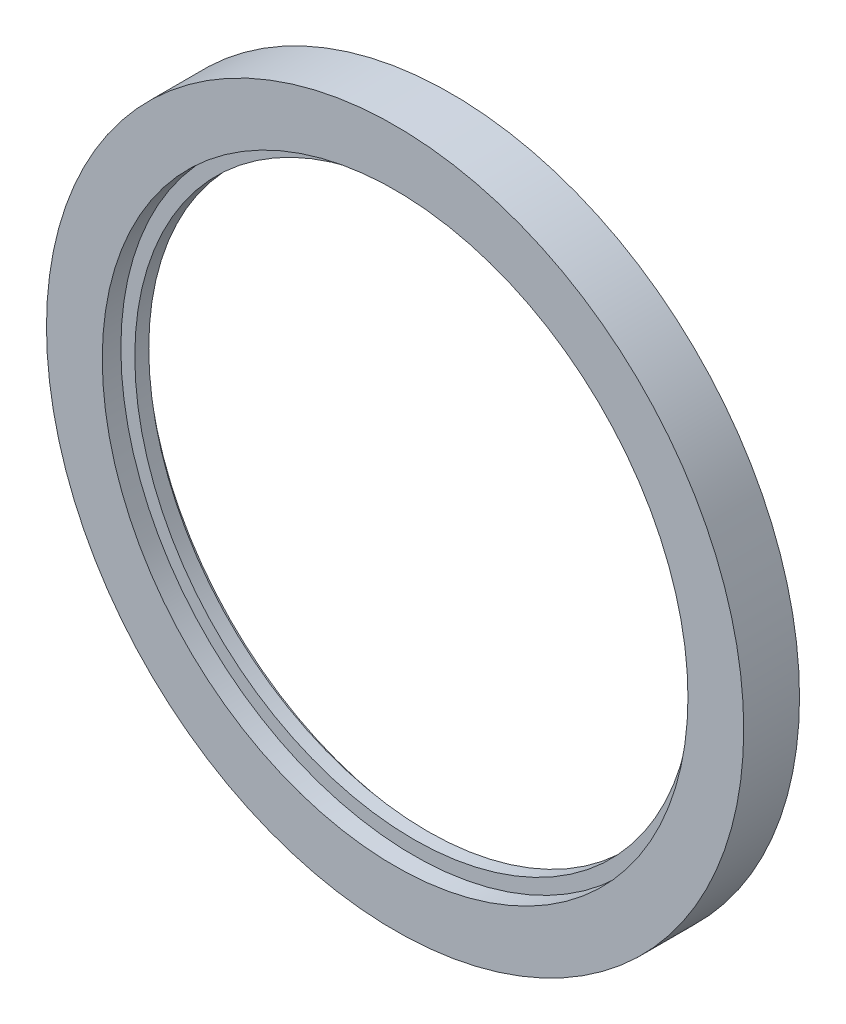
ISO-10303-21;
HEADER;
FILE_DESCRIPTION(('STEP AP214'),'2;1');
FILE_NAME('part.step','',(''),(''),'','','');
FILE_SCHEMA(('AUTOMOTIVE_DESIGN { 1 0 10303 214 1 1 1 1 }'));
ENDSEC;
DATA;
#1=APPLICATION_CONTEXT('core data for automotive mechanical design processes');
#2=APPLICATION_PROTOCOL_DEFINITION('international standard','automotive_design',2000,#1);
#3=PRODUCT_CONTEXT('',#1,'mechanical');
#4=PRODUCT('Part','Part','',(#3));
#5=PRODUCT_RELATED_PRODUCT_CATEGORY('part','',(#4));
#6=PRODUCT_DEFINITION_FORMATION('','',#4);
#7=PRODUCT_DEFINITION_CONTEXT('part definition',#1,'design');
#8=PRODUCT_DEFINITION('design','',#6,#7);
#9=PRODUCT_DEFINITION_SHAPE('','',#8);
#10=(LENGTH_UNIT() NAMED_UNIT(*) SI_UNIT(.MILLI.,.METRE.));
#11=(NAMED_UNIT(*) PLANE_ANGLE_UNIT() SI_UNIT($,.RADIAN.));
#12=(NAMED_UNIT(*) SI_UNIT($,.STERADIAN.) SOLID_ANGLE_UNIT());
#13=UNCERTAINTY_MEASURE_WITH_UNIT(LENGTH_MEASURE(1.E-05),#10,'distance_accuracy_value','');
#14=(GEOMETRIC_REPRESENTATION_CONTEXT(3) GLOBAL_UNCERTAINTY_ASSIGNED_CONTEXT((#13)) GLOBAL_UNIT_ASSIGNED_CONTEXT((#10,
#11,#12)) REPRESENTATION_CONTEXT('',''));
#15=CARTESIAN_POINT('',(0.,0.,0.));
#16=DIRECTION('',(0.,0.,1.));
#17=DIRECTION('',(1.,0.,0.));
#18=AXIS2_PLACEMENT_3D('',#15,#16,#17);
#19=CARTESIAN_POINT('',(0.,0.,8.));
#20=DIRECTION('',(0.,0.,1.));
#21=DIRECTION('',(1.,0.,0.));
#22=AXIS2_PLACEMENT_3D('',#19,#20,#21);
#23=PLANE('',#22);
#24=CARTESIAN_POINT('',(0.,0.,8.));
#25=DIRECTION('',(0.,0.,1.));
#26=DIRECTION('',(1.,0.,0.));
#27=AXIS2_PLACEMENT_3D('',#24,#25,#26);
#28=CIRCLE('',#27,60.);
#29=CARTESIAN_POINT('',(60.,0.,8.));
#30=VERTEX_POINT('',#29);
#31=EDGE_CURVE('E68',#30,#30,#28,.T.);
#32=ORIENTED_EDGE('',*,*,#31,.F.);
#33=EDGE_LOOP('',(#32));
#34=FACE_BOUND('',#33,.T.);
#35=CARTESIAN_POINT('',(0.,0.,8.));
#36=DIRECTION('',(0.,0.,1.));
#37=DIRECTION('',(1.,0.,0.));
#38=AXIS2_PLACEMENT_3D('',#35,#36,#37);
#39=CIRCLE('',#38,63.);
#40=CARTESIAN_POINT('',(63.,0.,8.));
#41=VERTEX_POINT('',#40);
#42=EDGE_CURVE('E81',#41,#41,#39,.T.);
#43=ORIENTED_EDGE('',*,*,#42,.T.);
#44=EDGE_LOOP('',(#43));
#45=FACE_BOUND('',#44,.T.);
#46=ADVANCED_FACE('F38',(#34,#45),#23,.T.);
#47=CARTESIAN_POINT('',(0.,0.,0.));
#48=DIRECTION('',(0.,0.,1.));
#49=DIRECTION('',(1.,0.,0.));
#50=AXIS2_PLACEMENT_3D('',#47,#48,#49);
#51=PLANE('',#50);
#52=CARTESIAN_POINT('',(0.,0.,0.));
#53=DIRECTION('',(0.,0.,1.));
#54=DIRECTION('',(1.,0.,0.));
#55=AXIS2_PLACEMENT_3D('',#52,#53,#54);
#56=CIRCLE('',#55,75.);
#57=CARTESIAN_POINT('',(75.,0.,0.));
#58=VERTEX_POINT('',#57);
#59=EDGE_CURVE('E10',#58,#58,#56,.T.);
#60=ORIENTED_EDGE('',*,*,#59,.F.);
#61=EDGE_LOOP('',(#60));
#62=FACE_BOUND('',#61,.T.);
#63=CARTESIAN_POINT('',(0.,0.,0.));
#64=DIRECTION('',(0.,0.,1.));
#65=DIRECTION('',(1.,0.,0.));
#66=AXIS2_PLACEMENT_3D('',#63,#64,#65);
#67=CIRCLE('',#66,67.5);
#68=CARTESIAN_POINT('',(67.5,0.,0.));
#69=VERTEX_POINT('',#68);
#70=EDGE_CURVE('E46',#69,#69,#67,.T.);
#71=ORIENTED_EDGE('',*,*,#70,.T.);
#72=EDGE_LOOP('',(#71));
#73=FACE_BOUND('',#72,.T.);
#74=ADVANCED_FACE('F107',(#62,#73),#51,.F.);
#75=CARTESIAN_POINT('',(0.,0.,3.3));
#76=DIRECTION('',(0.,0.,-1.));
#77=DIRECTION('',(-1.,0.,0.));
#78=AXIS2_PLACEMENT_3D('',#75,#76,#77);
#79=CYLINDRICAL_SURFACE('',#78,75.);
#80=ORIENTED_EDGE('',*,*,#59,.T.);
#81=EDGE_LOOP('',(#80));
#82=FACE_BOUND('',#81,.T.);
#83=CARTESIAN_POINT('',(0.,0.,12.));
#84=DIRECTION('',(0.,0.,1.));
#85=DIRECTION('',(1.,0.,0.));
#86=AXIS2_PLACEMENT_3D('',#83,#84,#85);
#87=CIRCLE('',#86,75.);
#88=CARTESIAN_POINT('',(75.,0.,12.));
#89=VERTEX_POINT('',#88);
#90=EDGE_CURVE('E73',#89,#89,#87,.T.);
#91=ORIENTED_EDGE('',*,*,#90,.F.);
#92=EDGE_LOOP('',(#91));
#93=FACE_BOUND('',#92,.T.);
#94=ADVANCED_FACE('F40',(#82,#93),#79,.T.);
#95=CARTESIAN_POINT('',(0.,0.,3.3));
#96=DIRECTION('',(0.,0.,-1.));
#97=DIRECTION('',(-1.,0.,0.));
#98=AXIS2_PLACEMENT_3D('',#95,#96,#97);
#99=CYLINDRICAL_SURFACE('',#98,67.5);
#100=CARTESIAN_POINT('',(0.,0.,3.3));
#101=DIRECTION('',(0.,0.,1.));
#102=DIRECTION('',(1.,0.,0.));
#103=AXIS2_PLACEMENT_3D('',#100,#101,#102);
#104=CIRCLE('',#103,67.5);
#105=CARTESIAN_POINT('',(67.5,0.,3.3));
#106=VERTEX_POINT('',#105);
#107=EDGE_CURVE('E52',#106,#106,#104,.T.);
#108=ORIENTED_EDGE('',*,*,#107,.T.);
#109=EDGE_LOOP('',(#108));
#110=FACE_BOUND('',#109,.T.);
#111=ORIENTED_EDGE('',*,*,#70,.F.);
#112=EDGE_LOOP('',(#111));
#113=FACE_BOUND('',#112,.T.);
#114=ADVANCED_FACE('F127',(#110,#113),#99,.F.);
#115=CARTESIAN_POINT('',(0.,0.,3.3));
#116=DIRECTION('',(0.,0.,1.));
#117=DIRECTION('',(1.,0.,0.));
#118=AXIS2_PLACEMENT_3D('',#115,#116,#117);
#119=PLANE('',#118);
#120=CARTESIAN_POINT('',(0.,0.,3.3));
#121=DIRECTION('',(0.,0.,1.));
#122=DIRECTION('',(1.,0.,0.));
#123=AXIS2_PLACEMENT_3D('',#120,#121,#122);
#124=CIRCLE('',#123,62.);
#125=CARTESIAN_POINT('',(62.,0.,3.3));
#126=VERTEX_POINT('',#125);
#127=EDGE_CURVE('E58',#126,#126,#124,.T.);
#128=ORIENTED_EDGE('',*,*,#127,.T.);
#129=EDGE_LOOP('',(#128));
#130=FACE_BOUND('',#129,.T.);
#131=ORIENTED_EDGE('',*,*,#107,.F.);
#132=EDGE_LOOP('',(#131));
#133=FACE_BOUND('',#132,.T.);
#134=ADVANCED_FACE('F123',(#130,#133),#119,.F.);
#135=CARTESIAN_POINT('',(0.,0.,5.));
#136=DIRECTION('',(0.,0.,-1.));
#137=DIRECTION('',(-1.,0.,0.));
#138=AXIS2_PLACEMENT_3D('',#135,#136,#137);
#139=CYLINDRICAL_SURFACE('',#138,62.);
#140=CARTESIAN_POINT('',(0.,0.,5.));
#141=DIRECTION('',(0.,0.,1.));
#142=DIRECTION('',(1.,0.,0.));
#143=AXIS2_PLACEMENT_3D('',#140,#141,#142);
#144=CIRCLE('',#143,62.);
#145=CARTESIAN_POINT('',(62.,0.,5.));
#146=VERTEX_POINT('',#145);
#147=EDGE_CURVE('E64',#146,#146,#144,.T.);
#148=ORIENTED_EDGE('',*,*,#147,.T.);
#149=EDGE_LOOP('',(#148));
#150=FACE_BOUND('',#149,.T.);
#151=ORIENTED_EDGE('',*,*,#127,.F.);
#152=EDGE_LOOP('',(#151));
#153=FACE_BOUND('',#152,.T.);
#154=ADVANCED_FACE('F119',(#150,#153),#139,.F.);
#155=CARTESIAN_POINT('',(0.,0.,5.));
#156=DIRECTION('',(0.,0.,1.));
#157=DIRECTION('',(1.,0.,0.));
#158=AXIS2_PLACEMENT_3D('',#155,#156,#157);
#159=PLANE('',#158);
#160=CARTESIAN_POINT('',(0.,0.,5.));
#161=DIRECTION('',(0.,0.,1.));
#162=DIRECTION('',(1.,0.,0.));
#163=AXIS2_PLACEMENT_3D('',#160,#161,#162);
#164=CIRCLE('',#163,60.);
#165=CARTESIAN_POINT('',(60.,0.,5.));
#166=VERTEX_POINT('',#165);
#167=EDGE_CURVE('E69',#166,#166,#164,.T.);
#168=ORIENTED_EDGE('',*,*,#167,.T.);
#169=EDGE_LOOP('',(#168));
#170=FACE_BOUND('',#169,.T.);
#171=ORIENTED_EDGE('',*,*,#147,.F.);
#172=EDGE_LOOP('',(#171));
#173=FACE_BOUND('',#172,.T.);
#174=ADVANCED_FACE('F103',(#170,#173),#159,.F.);
#175=CARTESIAN_POINT('',(0.,0.,8.));
#176=DIRECTION('',(0.,0.,-1.));
#177=DIRECTION('',(-1.,0.,0.));
#178=AXIS2_PLACEMENT_3D('',#175,#176,#177);
#179=CYLINDRICAL_SURFACE('',#178,60.);
#180=ORIENTED_EDGE('',*,*,#31,.T.);
#181=EDGE_LOOP('',(#180));
#182=FACE_BOUND('',#181,.T.);
#183=ORIENTED_EDGE('',*,*,#167,.F.);
#184=EDGE_LOOP('',(#183));
#185=FACE_BOUND('',#184,.T.);
#186=ADVANCED_FACE('F95',(#182,#185),#179,.F.);
#187=CARTESIAN_POINT('',(0.,0.,12.));
#188=DIRECTION('',(0.,0.,1.));
#189=DIRECTION('',(1.,0.,0.));
#190=AXIS2_PLACEMENT_3D('',#187,#188,#189);
#191=PLANE('',#190);
#192=ORIENTED_EDGE('',*,*,#90,.T.);
#193=EDGE_LOOP('',(#192));
#194=FACE_BOUND('',#193,.T.);
#195=CARTESIAN_POINT('',(0.,0.,12.));
#196=DIRECTION('',(0.,0.,1.));
#197=DIRECTION('',(1.,0.,0.));
#198=AXIS2_PLACEMENT_3D('',#195,#196,#197);
#199=CIRCLE('',#198,63.);
#200=CARTESIAN_POINT('',(63.,0.,12.));
#201=VERTEX_POINT('',#200);
#202=EDGE_CURVE('E80',#201,#201,#199,.T.);
#203=ORIENTED_EDGE('',*,*,#202,.F.);
#204=EDGE_LOOP('',(#203));
#205=FACE_BOUND('',#204,.T.);
#206=ADVANCED_FACE('F93',(#194,#205),#191,.T.);
#207=CARTESIAN_POINT('',(0.,0.,12.));
#208=DIRECTION('',(0.,0.,-1.));
#209=DIRECTION('',(-1.,0.,0.));
#210=AXIS2_PLACEMENT_3D('',#207,#208,#209);
#211=CYLINDRICAL_SURFACE('',#210,63.);
#212=ORIENTED_EDGE('',*,*,#202,.T.);
#213=EDGE_LOOP('',(#212));
#214=FACE_BOUND('',#213,.T.);
#215=ORIENTED_EDGE('',*,*,#42,.F.);
#216=EDGE_LOOP('',(#215));
#217=FACE_BOUND('',#216,.T.);
#218=ADVANCED_FACE('F90',(#214,#217),#211,.F.);
#219=CLOSED_SHELL('',(#46,#74,#94,#114,#134,#154,#174,#186,#206,#218));
#220=MANIFOLD_SOLID_BREP('B2',#219);
#221=ADVANCED_BREP_SHAPE_REPRESENTATION('',(#18,#220),#14);
#222=SHAPE_DEFINITION_REPRESENTATION(#9,#221);
ENDSEC;
END-ISO-10303-21;
